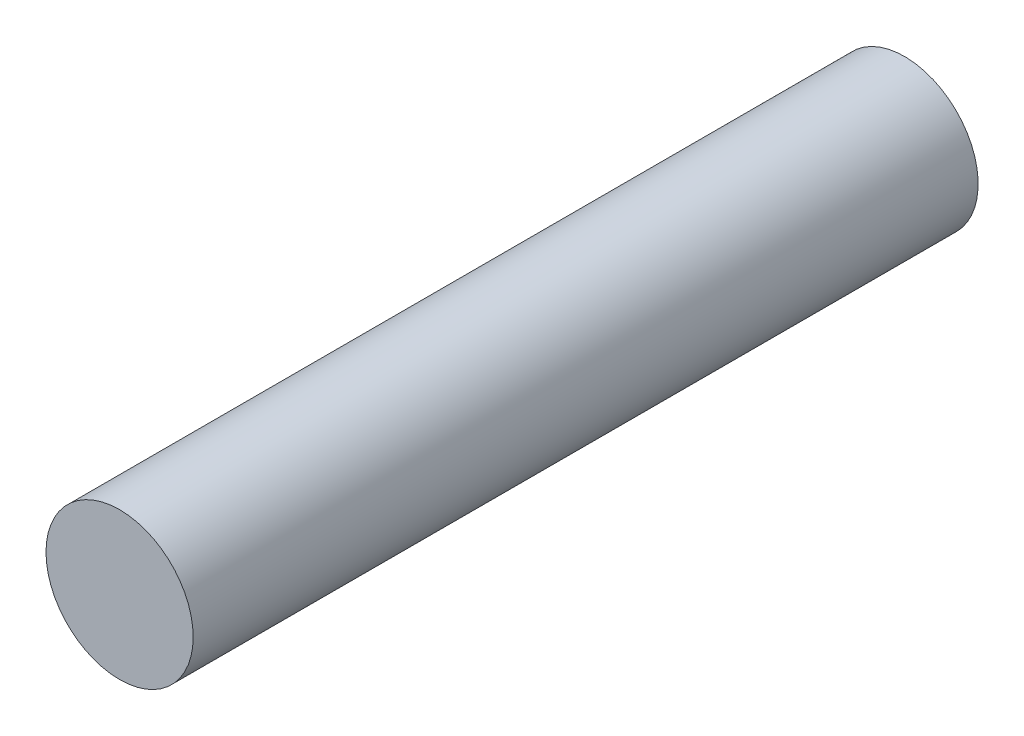
ISO-10303-21;
HEADER;
FILE_DESCRIPTION(('STEP AP214'),'2;1');
FILE_NAME('part.step','',(''),(''),'','','');
FILE_SCHEMA(('AUTOMOTIVE_DESIGN { 1 0 10303 214 1 1 1 1 }'));
ENDSEC;
DATA;
#1=APPLICATION_CONTEXT('core data for automotive mechanical design processes');
#2=APPLICATION_PROTOCOL_DEFINITION('international standard','automotive_design',2000,#1);
#3=PRODUCT_CONTEXT('',#1,'mechanical');
#4=PRODUCT('Part','Part','',(#3));
#5=PRODUCT_RELATED_PRODUCT_CATEGORY('part','',(#4));
#6=PRODUCT_DEFINITION_FORMATION('','',#4);
#7=PRODUCT_DEFINITION_CONTEXT('part definition',#1,'design');
#8=PRODUCT_DEFINITION('design','',#6,#7);
#9=PRODUCT_DEFINITION_SHAPE('','',#8);
#10=(LENGTH_UNIT() NAMED_UNIT(*) SI_UNIT(.MILLI.,.METRE.));
#11=(NAMED_UNIT(*) PLANE_ANGLE_UNIT() SI_UNIT($,.RADIAN.));
#12=(NAMED_UNIT(*) SI_UNIT($,.STERADIAN.) SOLID_ANGLE_UNIT());
#13=UNCERTAINTY_MEASURE_WITH_UNIT(LENGTH_MEASURE(1.E-05),#10,'distance_accuracy_value','');
#14=(GEOMETRIC_REPRESENTATION_CONTEXT(3) GLOBAL_UNCERTAINTY_ASSIGNED_CONTEXT((#13)) GLOBAL_UNIT_ASSIGNED_CONTEXT((#10,
#11,#12)) REPRESENTATION_CONTEXT('',''));
#15=CARTESIAN_POINT('',(0.,0.,0.));
#16=DIRECTION('',(0.,0.,1.));
#17=DIRECTION('',(1.,0.,0.));
#18=AXIS2_PLACEMENT_3D('',#15,#16,#17);
#19=CARTESIAN_POINT('',(0.,0.,53.5));
#20=DIRECTION('',(0.,0.,-1.));
#21=DIRECTION('',(-1.,0.,0.));
#22=AXIS2_PLACEMENT_3D('',#19,#20,#21);
#23=CYLINDRICAL_SURFACE('',#22,3.);
#24=CARTESIAN_POINT('',(0.,0.,53.5));
#25=DIRECTION('',(0.,0.,1.));
#26=DIRECTION('',(1.,0.,0.));
#27=AXIS2_PLACEMENT_3D('',#24,#25,#26);
#28=CIRCLE('',#27,3.);
#29=CARTESIAN_POINT('',(3.,0.,53.5));
#30=VERTEX_POINT('',#29);
#31=EDGE_CURVE('E10',#30,#30,#28,.T.);
#32=ORIENTED_EDGE('',*,*,#31,.F.);
#33=EDGE_LOOP('',(#32));
#34=FACE_BOUND('',#33,.T.);
#35=CARTESIAN_POINT('',(0.,0.,21.5));
#36=DIRECTION('',(0.,0.,-1.));
#37=DIRECTION('',(-1.,0.,0.));
#38=AXIS2_PLACEMENT_3D('',#35,#36,#37);
#39=CIRCLE('',#38,3.);
#40=CARTESIAN_POINT('',(-3.,0.,21.5));
#41=VERTEX_POINT('',#40);
#42=EDGE_CURVE('E44',#41,#41,#39,.T.);
#43=ORIENTED_EDGE('',*,*,#42,.F.);
#44=EDGE_LOOP('',(#43));
#45=FACE_BOUND('',#44,.T.);
#46=ADVANCED_FACE('F38',(#34,#45),#23,.T.);
#47=CARTESIAN_POINT('',(0.,0.,53.5));
#48=DIRECTION('',(0.,0.,1.));
#49=DIRECTION('',(1.,0.,0.));
#50=AXIS2_PLACEMENT_3D('',#47,#48,#49);
#51=PLANE('',#50);
#52=ORIENTED_EDGE('',*,*,#31,.T.);
#53=EDGE_LOOP('',(#52));
#54=FACE_BOUND('',#53,.T.);
#55=ADVANCED_FACE('F53',(#54),#51,.T.);
#56=CARTESIAN_POINT('',(0.,0.,21.5));
#57=DIRECTION('',(0.,0.,-1.));
#58=DIRECTION('',(-1.,0.,0.));
#59=AXIS2_PLACEMENT_3D('',#56,#57,#58);
#60=PLANE('',#59);
#61=ORIENTED_EDGE('',*,*,#42,.T.);
#62=EDGE_LOOP('',(#61));
#63=FACE_BOUND('',#62,.T.);
#64=ADVANCED_FACE('F50',(#63),#60,.T.);
#65=CLOSED_SHELL('',(#46,#55,#64));
#66=MANIFOLD_SOLID_BREP('B2',#65);
#67=ADVANCED_BREP_SHAPE_REPRESENTATION('',(#18,#66),#14);
#68=SHAPE_DEFINITION_REPRESENTATION(#9,#67);
ENDSEC;
END-ISO-10303-21;
